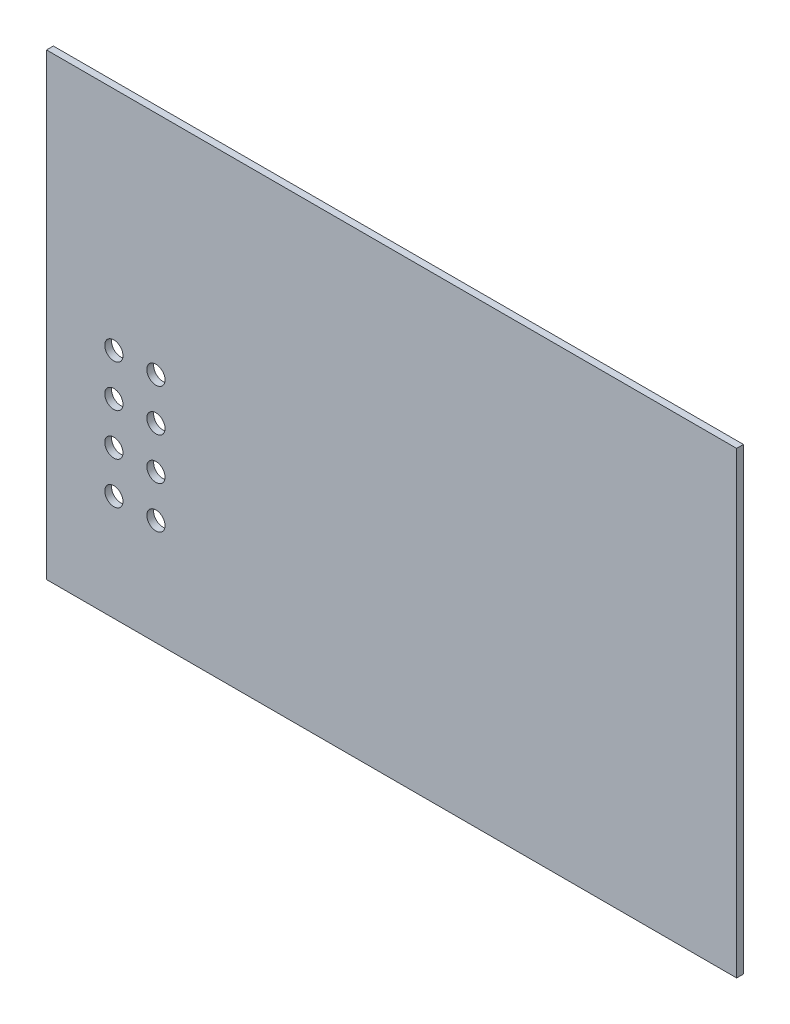
ISO-10303-21;
HEADER;
FILE_DESCRIPTION(('STEP AP214'),'2;1');
FILE_NAME('part.step','',(''),(''),'','','');
FILE_SCHEMA(('AUTOMOTIVE_DESIGN { 1 0 10303 214 1 1 1 1 }'));
ENDSEC;
DATA;
#1=APPLICATION_CONTEXT('core data for automotive mechanical design processes');
#2=APPLICATION_PROTOCOL_DEFINITION('international standard','automotive_design',2000,#1);
#3=PRODUCT_CONTEXT('',#1,'mechanical');
#4=PRODUCT('Part','Part','',(#3));
#5=PRODUCT_RELATED_PRODUCT_CATEGORY('part','',(#4));
#6=PRODUCT_DEFINITION_FORMATION('','',#4);
#7=PRODUCT_DEFINITION_CONTEXT('part definition',#1,'design');
#8=PRODUCT_DEFINITION('design','',#6,#7);
#9=PRODUCT_DEFINITION_SHAPE('','',#8);
#10=(LENGTH_UNIT() NAMED_UNIT(*) SI_UNIT(.MILLI.,.METRE.));
#11=(NAMED_UNIT(*) PLANE_ANGLE_UNIT() SI_UNIT($,.RADIAN.));
#12=(NAMED_UNIT(*) SI_UNIT($,.STERADIAN.) SOLID_ANGLE_UNIT());
#13=UNCERTAINTY_MEASURE_WITH_UNIT(LENGTH_MEASURE(1.E-05),#10,'distance_accuracy_value','');
#14=(GEOMETRIC_REPRESENTATION_CONTEXT(3) GLOBAL_UNCERTAINTY_ASSIGNED_CONTEXT((#13)) GLOBAL_UNIT_ASSIGNED_CONTEXT((#10,
#11,#12)) REPRESENTATION_CONTEXT('',''));
#15=CARTESIAN_POINT('',(0.,0.,0.));
#16=DIRECTION('',(0.,0.,1.));
#17=DIRECTION('',(1.,0.,0.));
#18=AXIS2_PLACEMENT_3D('',#15,#16,#17);
#19=CARTESIAN_POINT('',(0.,0.,0.41148));
#20=DIRECTION('',(0.,0.,-1.));
#21=DIRECTION('',(0.,-1.,0.));
#22=AXIS2_PLACEMENT_3D('',#19,#20,#21);
#23=PLANE('',#22);
#24=CARTESIAN_POINT('',(6.604,11.470132,0.41148));
#25=DIRECTION('',(0.,0.,1.));
#26=DIRECTION('',(1.,0.,0.));
#27=AXIS2_PLACEMENT_3D('',#24,#25,#26);
#28=CIRCLE('',#27,0.5499989);
#29=CARTESIAN_POINT('',(7.1539989,11.470132,0.41148));
#30=VERTEX_POINT('',#29);
#31=EDGE_CURVE('E25',#30,#30,#28,.T.);
#32=ORIENTED_EDGE('',*,*,#31,.F.);
#33=EDGE_LOOP('',(#32));
#34=FACE_BOUND('',#33,.T.);
#35=CARTESIAN_POINT('',(6.604,14.010132,0.41148));
#36=DIRECTION('',(0.,0.,1.));
#37=DIRECTION('',(1.,0.,0.));
#38=AXIS2_PLACEMENT_3D('',#35,#36,#37);
#39=CIRCLE('',#38,0.5499989);
#40=CARTESIAN_POINT('',(7.1539989,14.010132,0.41148));
#41=VERTEX_POINT('',#40);
#42=EDGE_CURVE('E199',#41,#41,#39,.T.);
#43=ORIENTED_EDGE('',*,*,#42,.F.);
#44=EDGE_LOOP('',(#43));
#45=FACE_BOUND('',#44,.T.);
#46=CARTESIAN_POINT('',(6.604,6.390132,0.41148));
#47=DIRECTION('',(0.,0.,1.));
#48=DIRECTION('',(1.,0.,0.));
#49=AXIS2_PLACEMENT_3D('',#46,#47,#48);
#50=CIRCLE('',#49,0.5499989);
#51=CARTESIAN_POINT('',(7.1539989,6.390132,0.41148));
#52=VERTEX_POINT('',#51);
#53=EDGE_CURVE('E183',#52,#52,#50,.T.);
#54=ORIENTED_EDGE('',*,*,#53,.F.);
#55=EDGE_LOOP('',(#54));
#56=FACE_BOUND('',#55,.T.);
#57=CARTESIAN_POINT('',(6.604,8.930132,0.41148));
#58=DIRECTION('',(0.,0.,1.));
#59=DIRECTION('',(1.,0.,0.));
#60=AXIS2_PLACEMENT_3D('',#57,#58,#59);
#61=CIRCLE('',#60,0.5499989);
#62=CARTESIAN_POINT('',(7.1539989,8.930132,0.41148));
#63=VERTEX_POINT('',#62);
#64=EDGE_CURVE('E61',#63,#63,#61,.T.);
#65=ORIENTED_EDGE('',*,*,#64,.F.);
#66=EDGE_LOOP('',(#65));
#67=FACE_BOUND('',#66,.T.);
#68=CARTESIAN_POINT('',(4.064,11.470132,0.41148));
#69=DIRECTION('',(0.,0.,1.));
#70=DIRECTION('',(1.,0.,0.));
#71=AXIS2_PLACEMENT_3D('',#68,#69,#70);
#72=CIRCLE('',#71,0.5499989);
#73=CARTESIAN_POINT('',(4.6139989,11.470132,0.41148));
#74=VERTEX_POINT('',#73);
#75=EDGE_CURVE('E206',#74,#74,#72,.T.);
#76=ORIENTED_EDGE('',*,*,#75,.F.);
#77=EDGE_LOOP('',(#76));
#78=FACE_BOUND('',#77,.T.);
#79=CARTESIAN_POINT('',(4.064,14.010132,0.41148));
#80=DIRECTION('',(0.,0.,1.));
#81=DIRECTION('',(1.,0.,0.));
#82=AXIS2_PLACEMENT_3D('',#79,#80,#81);
#83=CIRCLE('',#82,0.5499989);
#84=CARTESIAN_POINT('',(4.6139989,14.010132,0.41148));
#85=VERTEX_POINT('',#84);
#86=EDGE_CURVE('E188',#85,#85,#83,.T.);
#87=ORIENTED_EDGE('',*,*,#86,.F.);
#88=EDGE_LOOP('',(#87));
#89=FACE_BOUND('',#88,.T.);
#90=CARTESIAN_POINT('',(4.064,6.390132,0.41148));
#91=DIRECTION('',(0.,0.,1.));
#92=DIRECTION('',(1.,0.,0.));
#93=AXIS2_PLACEMENT_3D('',#90,#91,#92);
#94=CIRCLE('',#93,0.5499989);
#95=CARTESIAN_POINT('',(4.6139989,6.390132,0.41148));
#96=VERTEX_POINT('',#95);
#97=EDGE_CURVE('E244',#96,#96,#94,.T.);
#98=ORIENTED_EDGE('',*,*,#97,.F.);
#99=EDGE_LOOP('',(#98));
#100=FACE_BOUND('',#99,.T.);
#101=CARTESIAN_POINT('',(4.064,8.930132,0.41148));
#102=DIRECTION('',(0.,0.,1.));
#103=DIRECTION('',(1.,0.,0.));
#104=AXIS2_PLACEMENT_3D('',#101,#102,#103);
#105=CIRCLE('',#104,0.5499989);
#106=CARTESIAN_POINT('',(4.6139989,8.930132,0.41148));
#107=VERTEX_POINT('',#106);
#108=EDGE_CURVE('E198',#107,#107,#105,.T.);
#109=ORIENTED_EDGE('',*,*,#108,.F.);
#110=EDGE_LOOP('',(#109));
#111=FACE_BOUND('',#110,.T.);
#112=DIRECTION('',(1.,0.,0.));
#113=VECTOR('',#112,1.);
#114=CARTESIAN_POINT('',(0.,0.,0.41148));
#115=LINE('',#114,#113);
#116=CARTESIAN_POINT('',(0.,0.,0.41148));
#117=VERTEX_POINT('',#116);
#118=CARTESIAN_POINT('',(41.65599822998,0.,0.41148));
#119=VERTEX_POINT('',#118);
#120=EDGE_CURVE('E146',#117,#119,#115,.T.);
#121=ORIENTED_EDGE('',*,*,#120,.T.);
#122=DIRECTION('',(0.,1.,0.));
#123=VECTOR('',#122,1.);
#124=CARTESIAN_POINT('',(41.65599822998,0.,0.41148));
#125=LINE('',#124,#123);
#126=CARTESIAN_POINT('',(41.65599822998,27.686000823975,0.41148));
#127=VERTEX_POINT('',#126);
#128=EDGE_CURVE('E214',#119,#127,#125,.T.);
#129=ORIENTED_EDGE('',*,*,#128,.T.);
#130=DIRECTION('',(-1.,0.,0.));
#131=VECTOR('',#130,1.);
#132=CARTESIAN_POINT('',(41.65599822998,27.686000823975,0.41148));
#133=LINE('',#132,#131);
#134=CARTESIAN_POINT('',(0.,27.686000823975,0.41148));
#135=VERTEX_POINT('',#134);
#136=EDGE_CURVE('E149',#127,#135,#133,.T.);
#137=ORIENTED_EDGE('',*,*,#136,.T.);
#138=DIRECTION('',(0.,-1.,0.));
#139=VECTOR('',#138,1.);
#140=CARTESIAN_POINT('',(0.,27.686000823975,0.41148));
#141=LINE('',#140,#139);
#142=EDGE_CURVE('E142',#135,#117,#141,.T.);
#143=ORIENTED_EDGE('',*,*,#142,.T.);
#144=EDGE_LOOP('',(#121,#129,#137,#143));
#145=FACE_BOUND('',#144,.T.);
#146=ADVANCED_FACE('F16',(#34,#45,#56,#67,#78,#89,#100,#111,#145),#23,.F.);
#147=CARTESIAN_POINT('',(0.,0.,0.));
#148=DIRECTION('',(0.,0.,-1.));
#149=DIRECTION('',(0.,-1.,0.));
#150=AXIS2_PLACEMENT_3D('',#147,#148,#149);
#151=PLANE('',#150);
#152=CARTESIAN_POINT('',(6.604,11.470132,0.));
#153=DIRECTION('',(0.,0.,1.));
#154=DIRECTION('',(1.,0.,0.));
#155=AXIS2_PLACEMENT_3D('',#152,#153,#154);
#156=CIRCLE('',#155,0.5499989);
#157=CARTESIAN_POINT('',(7.1539989,11.470132,0.));
#158=VERTEX_POINT('',#157);
#159=EDGE_CURVE('E11',#158,#158,#156,.T.);
#160=ORIENTED_EDGE('',*,*,#159,.T.);
#161=EDGE_LOOP('',(#160));
#162=FACE_BOUND('',#161,.T.);
#163=CARTESIAN_POINT('',(6.604,14.010132,0.));
#164=DIRECTION('',(0.,0.,1.));
#165=DIRECTION('',(1.,0.,0.));
#166=AXIS2_PLACEMENT_3D('',#163,#164,#165);
#167=CIRCLE('',#166,0.5499989);
#168=CARTESIAN_POINT('',(7.1539989,14.010132,0.));
#169=VERTEX_POINT('',#168);
#170=EDGE_CURVE('E201',#169,#169,#167,.T.);
#171=ORIENTED_EDGE('',*,*,#170,.T.);
#172=EDGE_LOOP('',(#171));
#173=FACE_BOUND('',#172,.T.);
#174=CARTESIAN_POINT('',(6.604,6.390132,0.));
#175=DIRECTION('',(0.,0.,1.));
#176=DIRECTION('',(1.,0.,0.));
#177=AXIS2_PLACEMENT_3D('',#174,#175,#176);
#178=CIRCLE('',#177,0.5499989);
#179=CARTESIAN_POINT('',(7.1539989,6.390132,0.));
#180=VERTEX_POINT('',#179);
#181=EDGE_CURVE('E217',#180,#180,#178,.T.);
#182=ORIENTED_EDGE('',*,*,#181,.T.);
#183=EDGE_LOOP('',(#182));
#184=FACE_BOUND('',#183,.T.);
#185=CARTESIAN_POINT('',(6.604,8.930132,0.));
#186=DIRECTION('',(0.,0.,1.));
#187=DIRECTION('',(1.,0.,0.));
#188=AXIS2_PLACEMENT_3D('',#185,#186,#187);
#189=CIRCLE('',#188,0.5499989);
#190=CARTESIAN_POINT('',(7.1539989,8.930132,0.));
#191=VERTEX_POINT('',#190);
#192=EDGE_CURVE('E74',#191,#191,#189,.T.);
#193=ORIENTED_EDGE('',*,*,#192,.T.);
#194=EDGE_LOOP('',(#193));
#195=FACE_BOUND('',#194,.T.);
#196=CARTESIAN_POINT('',(4.064,11.470132,0.));
#197=DIRECTION('',(0.,0.,1.));
#198=DIRECTION('',(1.,0.,0.));
#199=AXIS2_PLACEMENT_3D('',#196,#197,#198);
#200=CIRCLE('',#199,0.5499989);
#201=CARTESIAN_POINT('',(4.6139989,11.470132,0.));
#202=VERTEX_POINT('',#201);
#203=EDGE_CURVE('E209',#202,#202,#200,.T.);
#204=ORIENTED_EDGE('',*,*,#203,.T.);
#205=EDGE_LOOP('',(#204));
#206=FACE_BOUND('',#205,.T.);
#207=CARTESIAN_POINT('',(4.064,14.010132,0.));
#208=DIRECTION('',(0.,0.,1.));
#209=DIRECTION('',(1.,0.,0.));
#210=AXIS2_PLACEMENT_3D('',#207,#208,#209);
#211=CIRCLE('',#210,0.5499989);
#212=CARTESIAN_POINT('',(4.6139989,14.010132,0.));
#213=VERTEX_POINT('',#212);
#214=EDGE_CURVE('E241',#213,#213,#211,.T.);
#215=ORIENTED_EDGE('',*,*,#214,.T.);
#216=EDGE_LOOP('',(#215));
#217=FACE_BOUND('',#216,.T.);
#218=CARTESIAN_POINT('',(4.064,6.390132,0.));
#219=DIRECTION('',(0.,0.,1.));
#220=DIRECTION('',(1.,0.,0.));
#221=AXIS2_PLACEMENT_3D('',#218,#219,#220);
#222=CIRCLE('',#221,0.5499989);
#223=CARTESIAN_POINT('',(4.6139989,6.390132,0.));
#224=VERTEX_POINT('',#223);
#225=EDGE_CURVE('E189',#224,#224,#222,.T.);
#226=ORIENTED_EDGE('',*,*,#225,.T.);
#227=EDGE_LOOP('',(#226));
#228=FACE_BOUND('',#227,.T.);
#229=CARTESIAN_POINT('',(4.064,8.930132,0.));
#230=DIRECTION('',(0.,0.,1.));
#231=DIRECTION('',(1.,0.,0.));
#232=AXIS2_PLACEMENT_3D('',#229,#230,#231);
#233=CIRCLE('',#232,0.5499989);
#234=CARTESIAN_POINT('',(4.6139989,8.930132,0.));
#235=VERTEX_POINT('',#234);
#236=EDGE_CURVE('E194',#235,#235,#233,.T.);
#237=ORIENTED_EDGE('',*,*,#236,.T.);
#238=EDGE_LOOP('',(#237));
#239=FACE_BOUND('',#238,.T.);
#240=DIRECTION('',(0.,-1.,0.));
#241=VECTOR('',#240,1.);
#242=CARTESIAN_POINT('',(0.,27.686000823975,0.));
#243=LINE('',#242,#241);
#244=CARTESIAN_POINT('',(0.,27.686000823975,0.));
#245=VERTEX_POINT('',#244);
#246=CARTESIAN_POINT('',(0.,0.,0.));
#247=VERTEX_POINT('',#246);
#248=EDGE_CURVE('E155',#245,#247,#243,.T.);
#249=ORIENTED_EDGE('',*,*,#248,.F.);
#250=DIRECTION('',(-1.,0.,0.));
#251=VECTOR('',#250,1.);
#252=CARTESIAN_POINT('',(41.65599822998,27.686000823975,0.));
#253=LINE('',#252,#251);
#254=CARTESIAN_POINT('',(41.65599822998,27.686000823975,0.));
#255=VERTEX_POINT('',#254);
#256=EDGE_CURVE('E221',#255,#245,#253,.T.);
#257=ORIENTED_EDGE('',*,*,#256,.F.);
#258=DIRECTION('',(0.,1.,0.));
#259=VECTOR('',#258,1.);
#260=CARTESIAN_POINT('',(41.65599822998,0.,0.));
#261=LINE('',#260,#259);
#262=CARTESIAN_POINT('',(41.65599822998,0.,0.));
#263=VERTEX_POINT('',#262);
#264=EDGE_CURVE('E164',#263,#255,#261,.T.);
#265=ORIENTED_EDGE('',*,*,#264,.F.);
#266=DIRECTION('',(1.,0.,0.));
#267=VECTOR('',#266,1.);
#268=CARTESIAN_POINT('',(0.,0.,0.));
#269=LINE('',#268,#267);
#270=EDGE_CURVE('E174',#247,#263,#269,.T.);
#271=ORIENTED_EDGE('',*,*,#270,.F.);
#272=EDGE_LOOP('',(#249,#257,#265,#271));
#273=FACE_BOUND('',#272,.T.);
#274=ADVANCED_FACE('F277',(#162,#173,#184,#195,#206,#217,#228,#239,#273),#151,.T.);
#275=CARTESIAN_POINT('',(6.604,11.470132,0.));
#276=DIRECTION('',(0.,0.,-1.));
#277=DIRECTION('',(1.,0.,0.));
#278=AXIS2_PLACEMENT_3D('',#275,#276,#277);
#279=CYLINDRICAL_SURFACE('',#278,0.5499989);
#280=DIRECTION('',(0.,0.,1.));
#281=VECTOR('',#280,1.);
#282=CARTESIAN_POINT('',(7.1539989,11.470132,0.));
#283=LINE('',#282,#281);
#284=EDGE_CURVE('E227',#158,#30,#283,.T.);
#285=ORIENTED_EDGE('',*,*,#284,.T.);
#286=ORIENTED_EDGE('',*,*,#31,.T.);
#287=ORIENTED_EDGE('',*,*,#284,.F.);
#288=ORIENTED_EDGE('',*,*,#159,.F.);
#289=EDGE_LOOP('',(#285,#286,#287,#288));
#290=FACE_BOUND('',#289,.T.);
#291=ADVANCED_FACE('F283',(#290),#279,.F.);
#292=CARTESIAN_POINT('',(6.604,14.010132,0.));
#293=DIRECTION('',(0.,0.,-1.));
#294=DIRECTION('',(1.,0.,0.));
#295=AXIS2_PLACEMENT_3D('',#292,#293,#294);
#296=CYLINDRICAL_SURFACE('',#295,0.5499989);
#297=DIRECTION('',(0.,0.,1.));
#298=VECTOR('',#297,1.);
#299=CARTESIAN_POINT('',(7.1539989,14.010132,0.));
#300=LINE('',#299,#298);
#301=EDGE_CURVE('E202',#169,#41,#300,.T.);
#302=ORIENTED_EDGE('',*,*,#301,.T.);
#303=ORIENTED_EDGE('',*,*,#42,.T.);
#304=ORIENTED_EDGE('',*,*,#301,.F.);
#305=ORIENTED_EDGE('',*,*,#170,.F.);
#306=EDGE_LOOP('',(#302,#303,#304,#305));
#307=FACE_BOUND('',#306,.T.);
#308=ADVANCED_FACE('F333',(#307),#296,.F.);
#309=CARTESIAN_POINT('',(6.604,6.390132,0.));
#310=DIRECTION('',(0.,0.,-1.));
#311=DIRECTION('',(1.,0.,0.));
#312=AXIS2_PLACEMENT_3D('',#309,#310,#311);
#313=CYLINDRICAL_SURFACE('',#312,0.5499989);
#314=DIRECTION('',(0.,0.,1.));
#315=VECTOR('',#314,1.);
#316=CARTESIAN_POINT('',(7.1539989,6.390132,0.));
#317=LINE('',#316,#315);
#318=EDGE_CURVE('E179',#180,#52,#317,.T.);
#319=ORIENTED_EDGE('',*,*,#318,.T.);
#320=ORIENTED_EDGE('',*,*,#53,.T.);
#321=ORIENTED_EDGE('',*,*,#318,.F.);
#322=ORIENTED_EDGE('',*,*,#181,.F.);
#323=EDGE_LOOP('',(#319,#320,#321,#322));
#324=FACE_BOUND('',#323,.T.);
#325=ADVANCED_FACE('F335',(#324),#313,.F.);
#326=CARTESIAN_POINT('',(6.604,8.930132,0.));
#327=DIRECTION('',(0.,0.,-1.));
#328=DIRECTION('',(1.,0.,0.));
#329=AXIS2_PLACEMENT_3D('',#326,#327,#328);
#330=CYLINDRICAL_SURFACE('',#329,0.5499989);
#331=DIRECTION('',(0.,0.,1.));
#332=VECTOR('',#331,1.);
#333=CARTESIAN_POINT('',(7.1539989,8.930132,0.));
#334=LINE('',#333,#332);
#335=EDGE_CURVE('E230',#191,#63,#334,.T.);
#336=ORIENTED_EDGE('',*,*,#335,.T.);
#337=ORIENTED_EDGE('',*,*,#64,.T.);
#338=ORIENTED_EDGE('',*,*,#335,.F.);
#339=ORIENTED_EDGE('',*,*,#192,.F.);
#340=EDGE_LOOP('',(#336,#337,#338,#339));
#341=FACE_BOUND('',#340,.T.);
#342=ADVANCED_FACE('F321',(#341),#330,.F.);
#343=CARTESIAN_POINT('',(4.064,11.470132,0.));
#344=DIRECTION('',(0.,0.,-1.));
#345=DIRECTION('',(1.,0.,0.));
#346=AXIS2_PLACEMENT_3D('',#343,#344,#345);
#347=CYLINDRICAL_SURFACE('',#346,0.5499989);
#348=DIRECTION('',(0.,0.,1.));
#349=VECTOR('',#348,1.);
#350=CARTESIAN_POINT('',(4.6139989,11.470132,0.));
#351=LINE('',#350,#349);
#352=EDGE_CURVE('E210',#202,#74,#351,.T.);
#353=ORIENTED_EDGE('',*,*,#352,.T.);
#354=ORIENTED_EDGE('',*,*,#75,.T.);
#355=ORIENTED_EDGE('',*,*,#352,.F.);
#356=ORIENTED_EDGE('',*,*,#203,.F.);
#357=EDGE_LOOP('',(#353,#354,#355,#356));
#358=FACE_BOUND('',#357,.T.);
#359=ADVANCED_FACE('F322',(#358),#347,.F.);
#360=CARTESIAN_POINT('',(4.064,14.010132,0.));
#361=DIRECTION('',(0.,0.,-1.));
#362=DIRECTION('',(1.,0.,0.));
#363=AXIS2_PLACEMENT_3D('',#360,#361,#362);
#364=CYLINDRICAL_SURFACE('',#363,0.5499989);
#365=DIRECTION('',(0.,0.,1.));
#366=VECTOR('',#365,1.);
#367=CARTESIAN_POINT('',(4.6139989,14.010132,0.));
#368=LINE('',#367,#366);
#369=EDGE_CURVE('E184',#213,#85,#368,.T.);
#370=ORIENTED_EDGE('',*,*,#369,.T.);
#371=ORIENTED_EDGE('',*,*,#86,.T.);
#372=ORIENTED_EDGE('',*,*,#369,.F.);
#373=ORIENTED_EDGE('',*,*,#214,.F.);
#374=EDGE_LOOP('',(#370,#371,#372,#373));
#375=FACE_BOUND('',#374,.T.);
#376=ADVANCED_FACE('F324',(#375),#364,.F.);
#377=CARTESIAN_POINT('',(4.064,6.390132,0.));
#378=DIRECTION('',(0.,0.,-1.));
#379=DIRECTION('',(1.,0.,0.));
#380=AXIS2_PLACEMENT_3D('',#377,#378,#379);
#381=CYLINDRICAL_SURFACE('',#380,0.5499989);
#382=DIRECTION('',(0.,0.,1.));
#383=VECTOR('',#382,1.);
#384=CARTESIAN_POINT('',(4.6139989,6.390132,0.));
#385=LINE('',#384,#383);
#386=EDGE_CURVE('E197',#224,#96,#385,.T.);
#387=ORIENTED_EDGE('',*,*,#386,.T.);
#388=ORIENTED_EDGE('',*,*,#97,.T.);
#389=ORIENTED_EDGE('',*,*,#386,.F.);
#390=ORIENTED_EDGE('',*,*,#225,.F.);
#391=EDGE_LOOP('',(#387,#388,#389,#390));
#392=FACE_BOUND('',#391,.T.);
#393=ADVANCED_FACE('F299',(#392),#381,.F.);
#394=CARTESIAN_POINT('',(4.064,8.930132,0.));
#395=DIRECTION('',(0.,0.,-1.));
#396=DIRECTION('',(1.,0.,0.));
#397=AXIS2_PLACEMENT_3D('',#394,#395,#396);
#398=CYLINDRICAL_SURFACE('',#397,0.5499989);
#399=DIRECTION('',(0.,0.,1.));
#400=VECTOR('',#399,1.);
#401=CARTESIAN_POINT('',(4.6139989,8.930132,0.));
#402=LINE('',#401,#400);
#403=EDGE_CURVE('E154',#235,#107,#402,.T.);
#404=ORIENTED_EDGE('',*,*,#403,.T.);
#405=ORIENTED_EDGE('',*,*,#108,.T.);
#406=ORIENTED_EDGE('',*,*,#403,.F.);
#407=ORIENTED_EDGE('',*,*,#236,.F.);
#408=EDGE_LOOP('',(#404,#405,#406,#407));
#409=FACE_BOUND('',#408,.T.);
#410=ADVANCED_FACE('F273',(#409),#398,.F.);
#411=CARTESIAN_POINT('',(0.,27.686000823975,0.));
#412=DIRECTION('',(1.,0.,0.));
#413=DIRECTION('',(0.,1.,0.));
#414=AXIS2_PLACEMENT_3D('',#411,#412,#413);
#415=PLANE('',#414);
#416=ORIENTED_EDGE('',*,*,#248,.T.);
#417=DIRECTION('',(0.,0.,1.));
#418=VECTOR('',#417,1.);
#419=CARTESIAN_POINT('',(0.,0.,0.));
#420=LINE('',#419,#418);
#421=EDGE_CURVE('E158',#247,#117,#420,.T.);
#422=ORIENTED_EDGE('',*,*,#421,.T.);
#423=ORIENTED_EDGE('',*,*,#142,.F.);
#424=DIRECTION('',(0.,0.,1.));
#425=VECTOR('',#424,1.);
#426=CARTESIAN_POINT('',(0.,27.686000823975,0.));
#427=LINE('',#426,#425);
#428=EDGE_CURVE('E178',#245,#135,#427,.T.);
#429=ORIENTED_EDGE('',*,*,#428,.F.);
#430=EDGE_LOOP('',(#416,#422,#423,#429));
#431=FACE_BOUND('',#430,.T.);
#432=ADVANCED_FACE('F159',(#431),#415,.F.);
#433=CARTESIAN_POINT('',(41.65599822998,27.686000823975,0.));
#434=DIRECTION('',(0.,-1.,0.));
#435=DIRECTION('',(0.,0.,-1.));
#436=AXIS2_PLACEMENT_3D('',#433,#434,#435);
#437=PLANE('',#436);
#438=ORIENTED_EDGE('',*,*,#256,.T.);
#439=ORIENTED_EDGE('',*,*,#428,.T.);
#440=ORIENTED_EDGE('',*,*,#136,.F.);
#441=DIRECTION('',(0.,0.,1.));
#442=VECTOR('',#441,1.);
#443=CARTESIAN_POINT('',(41.65599822998,27.686000823975,0.));
#444=LINE('',#443,#442);
#445=EDGE_CURVE('E193',#255,#127,#444,.T.);
#446=ORIENTED_EDGE('',*,*,#445,.F.);
#447=EDGE_LOOP('',(#438,#439,#440,#446));
#448=FACE_BOUND('',#447,.T.);
#449=ADVANCED_FACE('F305',(#448),#437,.F.);
#450=CARTESIAN_POINT('',(41.65599822998,0.,0.));
#451=DIRECTION('',(-1.,0.,0.));
#452=DIRECTION('',(0.,0.,1.));
#453=AXIS2_PLACEMENT_3D('',#450,#451,#452);
#454=PLANE('',#453);
#455=ORIENTED_EDGE('',*,*,#264,.T.);
#456=ORIENTED_EDGE('',*,*,#445,.T.);
#457=ORIENTED_EDGE('',*,*,#128,.F.);
#458=DIRECTION('',(0.,0.,1.));
#459=VECTOR('',#458,1.);
#460=CARTESIAN_POINT('',(41.65599822998,0.,0.));
#461=LINE('',#460,#459);
#462=EDGE_CURVE('E19',#263,#119,#461,.T.);
#463=ORIENTED_EDGE('',*,*,#462,.F.);
#464=EDGE_LOOP('',(#455,#456,#457,#463));
#465=FACE_BOUND('',#464,.T.);
#466=ADVANCED_FACE('F307',(#465),#454,.F.);
#467=CARTESIAN_POINT('',(0.,0.,0.));
#468=DIRECTION('',(0.,1.,0.));
#469=DIRECTION('',(1.,0.,0.));
#470=AXIS2_PLACEMENT_3D('',#467,#468,#469);
#471=PLANE('',#470);
#472=ORIENTED_EDGE('',*,*,#270,.T.);
#473=ORIENTED_EDGE('',*,*,#462,.T.);
#474=ORIENTED_EDGE('',*,*,#120,.F.);
#475=ORIENTED_EDGE('',*,*,#421,.F.);
#476=EDGE_LOOP('',(#472,#473,#474,#475));
#477=FACE_BOUND('',#476,.T.);
#478=ADVANCED_FACE('F166',(#477),#471,.F.);
#479=CLOSED_SHELL('',(#146,#274,#291,#308,#325,#342,#359,#376,#393,#410,#432,#449,#466,#478));
#480=MANIFOLD_SOLID_BREP('B1',#479);
#481=ADVANCED_BREP_SHAPE_REPRESENTATION('',(#18,#480),#14);
#482=SHAPE_DEFINITION_REPRESENTATION(#9,#481);
ENDSEC;
END-ISO-10303-21;
